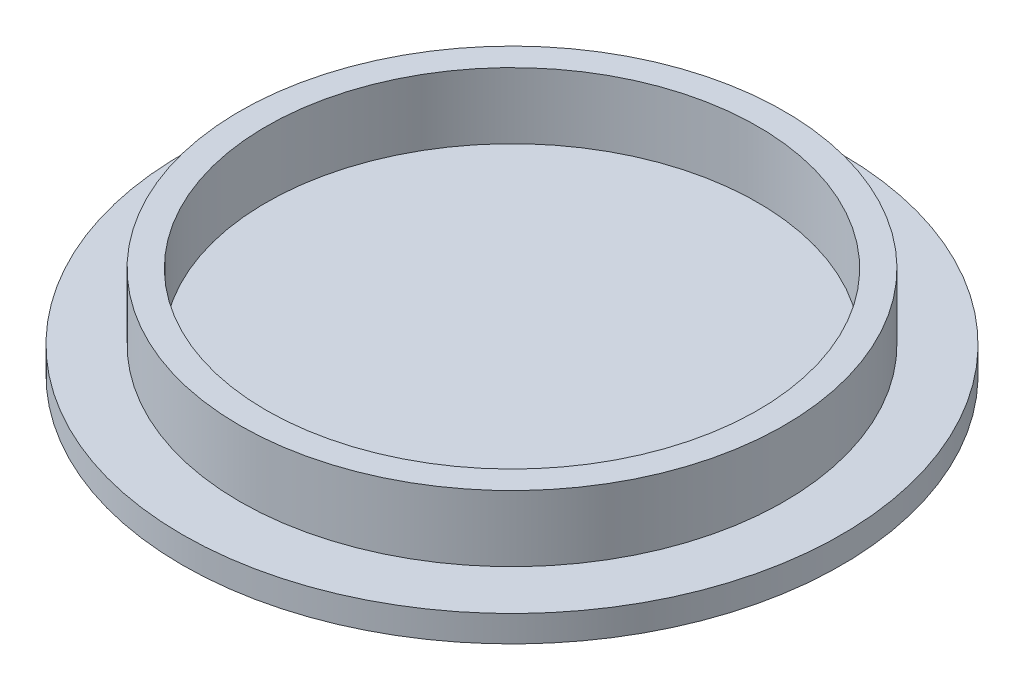
ISO-10303-21;
HEADER;
FILE_DESCRIPTION(('STEP AP214'),'2;1');
FILE_NAME('part.step','',(''),(''),'','','');
FILE_SCHEMA(('AUTOMOTIVE_DESIGN { 1 0 10303 214 1 1 1 1 }'));
ENDSEC;
DATA;
#1=APPLICATION_CONTEXT('core data for automotive mechanical design processes');
#2=APPLICATION_PROTOCOL_DEFINITION('international standard','automotive_design',2000,#1);
#3=PRODUCT_CONTEXT('',#1,'mechanical');
#4=PRODUCT('Part','Part','',(#3));
#5=PRODUCT_RELATED_PRODUCT_CATEGORY('part','',(#4));
#6=PRODUCT_DEFINITION_FORMATION('','',#4);
#7=PRODUCT_DEFINITION_CONTEXT('part definition',#1,'design');
#8=PRODUCT_DEFINITION('design','',#6,#7);
#9=PRODUCT_DEFINITION_SHAPE('','',#8);
#10=(LENGTH_UNIT() NAMED_UNIT(*) SI_UNIT(.MILLI.,.METRE.));
#11=(NAMED_UNIT(*) PLANE_ANGLE_UNIT() SI_UNIT($,.RADIAN.));
#12=(NAMED_UNIT(*) SI_UNIT($,.STERADIAN.) SOLID_ANGLE_UNIT());
#13=UNCERTAINTY_MEASURE_WITH_UNIT(LENGTH_MEASURE(1.E-05),#10,'distance_accuracy_value','');
#14=(GEOMETRIC_REPRESENTATION_CONTEXT(3) GLOBAL_UNCERTAINTY_ASSIGNED_CONTEXT((#13)) GLOBAL_UNIT_ASSIGNED_CONTEXT((#10,
#11,#12)) REPRESENTATION_CONTEXT('',''));
#15=CARTESIAN_POINT('',(0.,0.,0.));
#16=DIRECTION('',(0.,0.,1.));
#17=DIRECTION('',(1.,0.,0.));
#18=AXIS2_PLACEMENT_3D('',#15,#16,#17);
#19=CARTESIAN_POINT('',(0.,5.08,0.));
#20=DIRECTION('',(0.,-1.,0.));
#21=DIRECTION('',(0.,0.,-1.));
#22=AXIS2_PLACEMENT_3D('',#19,#20,#21);
#23=CYLINDRICAL_SURFACE('',#22,63.5);
#24=CARTESIAN_POINT('',(0.,5.08,0.));
#25=DIRECTION('',(0.,1.,0.));
#26=DIRECTION('',(0.,0.,1.));
#27=AXIS2_PLACEMENT_3D('',#24,#25,#26);
#28=CIRCLE('',#27,63.5);
#29=CARTESIAN_POINT('',(0.,5.08,63.5));
#30=VERTEX_POINT('',#29);
#31=EDGE_CURVE('E48',#30,#30,#28,.T.);
#32=ORIENTED_EDGE('',*,*,#31,.F.);
#33=EDGE_LOOP('',(#32));
#34=FACE_BOUND('',#33,.T.);
#35=CARTESIAN_POINT('',(0.,0.,0.));
#36=DIRECTION('',(0.,1.,0.));
#37=DIRECTION('',(0.,0.,1.));
#38=AXIS2_PLACEMENT_3D('',#35,#36,#37);
#39=CIRCLE('',#38,63.5);
#40=CARTESIAN_POINT('',(0.,0.,63.5));
#41=VERTEX_POINT('',#40);
#42=EDGE_CURVE('E53',#41,#41,#39,.T.);
#43=ORIENTED_EDGE('',*,*,#42,.T.);
#44=EDGE_LOOP('',(#43));
#45=FACE_BOUND('',#44,.T.);
#46=ADVANCED_FACE('F41',(#34,#45),#23,.T.);
#47=CARTESIAN_POINT('',(0.,5.08,0.));
#48=DIRECTION('',(0.,1.,0.));
#49=DIRECTION('',(0.,0.,1.));
#50=AXIS2_PLACEMENT_3D('',#47,#48,#49);
#51=PLANE('',#50);
#52=CARTESIAN_POINT('',(0.,5.08,0.));
#53=DIRECTION('',(0.,1.,0.));
#54=DIRECTION('',(0.,0.,1.));
#55=AXIS2_PLACEMENT_3D('',#52,#53,#54);
#56=CIRCLE('',#55,52.451);
#57=CARTESIAN_POINT('',(0.,5.08,52.451));
#58=VERTEX_POINT('',#57);
#59=EDGE_CURVE('E61',#58,#58,#56,.T.);
#60=ORIENTED_EDGE('',*,*,#59,.F.);
#61=EDGE_LOOP('',(#60));
#62=FACE_BOUND('',#61,.T.);
#63=ORIENTED_EDGE('',*,*,#31,.T.);
#64=EDGE_LOOP('',(#63));
#65=FACE_BOUND('',#64,.T.);
#66=ADVANCED_FACE('F87',(#62,#65),#51,.T.);
#67=CARTESIAN_POINT('',(0.,0.,0.));
#68=DIRECTION('',(0.,1.,0.));
#69=DIRECTION('',(0.,0.,1.));
#70=AXIS2_PLACEMENT_3D('',#67,#68,#69);
#71=PLANE('',#70);
#72=ORIENTED_EDGE('',*,*,#42,.F.);
#73=EDGE_LOOP('',(#72));
#74=FACE_BOUND('',#73,.T.);
#75=ADVANCED_FACE('F78',(#74),#71,.F.);
#76=CARTESIAN_POINT('',(0.,17.78,0.));
#77=DIRECTION('',(0.,1.,0.));
#78=DIRECTION('',(0.,0.,1.));
#79=AXIS2_PLACEMENT_3D('',#76,#77,#78);
#80=PLANE('',#79);
#81=CARTESIAN_POINT('',(0.,17.78,0.));
#82=DIRECTION('',(0.,1.,0.));
#83=DIRECTION('',(0.,0.,1.));
#84=AXIS2_PLACEMENT_3D('',#81,#82,#83);
#85=CIRCLE('',#84,52.451);
#86=CARTESIAN_POINT('',(0.,17.78,52.451));
#87=VERTEX_POINT('',#86);
#88=EDGE_CURVE('E59',#87,#87,#85,.T.);
#89=ORIENTED_EDGE('',*,*,#88,.T.);
#90=EDGE_LOOP('',(#89));
#91=FACE_BOUND('',#90,.T.);
#92=CARTESIAN_POINT('',(0.,17.78,0.));
#93=DIRECTION('',(0.,1.,0.));
#94=DIRECTION('',(0.,0.,1.));
#95=AXIS2_PLACEMENT_3D('',#92,#93,#94);
#96=CIRCLE('',#95,47.371);
#97=CARTESIAN_POINT('',(0.,17.78,47.371));
#98=VERTEX_POINT('',#97);
#99=EDGE_CURVE('E65',#98,#98,#96,.T.);
#100=ORIENTED_EDGE('',*,*,#99,.F.);
#101=EDGE_LOOP('',(#100));
#102=FACE_BOUND('',#101,.T.);
#103=ADVANCED_FACE('F75',(#91,#102),#80,.T.);
#104=CARTESIAN_POINT('',(0.,17.78,0.));
#105=DIRECTION('',(0.,-1.,0.));
#106=DIRECTION('',(0.,0.,-1.));
#107=AXIS2_PLACEMENT_3D('',#104,#105,#106);
#108=CYLINDRICAL_SURFACE('',#107,52.451);
#109=ORIENTED_EDGE('',*,*,#88,.F.);
#110=EDGE_LOOP('',(#109));
#111=FACE_BOUND('',#110,.T.);
#112=ORIENTED_EDGE('',*,*,#59,.T.);
#113=EDGE_LOOP('',(#112));
#114=FACE_BOUND('',#113,.T.);
#115=ADVANCED_FACE('F77',(#111,#114),#108,.T.);
#116=CARTESIAN_POINT('',(0.,17.78,0.));
#117=DIRECTION('',(0.,-1.,0.));
#118=DIRECTION('',(0.,0.,-1.));
#119=AXIS2_PLACEMENT_3D('',#116,#117,#118);
#120=CYLINDRICAL_SURFACE('',#119,47.371);
#121=ORIENTED_EDGE('',*,*,#99,.T.);
#122=EDGE_LOOP('',(#121));
#123=FACE_BOUND('',#122,.T.);
#124=CARTESIAN_POINT('',(0.,5.08,0.));
#125=DIRECTION('',(0.,1.,0.));
#126=DIRECTION('',(0.,0.,1.));
#127=AXIS2_PLACEMENT_3D('',#124,#125,#126);
#128=CIRCLE('',#127,47.371);
#129=CARTESIAN_POINT('',(0.,5.08,47.371));
#130=VERTEX_POINT('',#129);
#131=EDGE_CURVE('E10',#130,#130,#128,.F.);
#132=ORIENTED_EDGE('',*,*,#131,.T.);
#133=EDGE_LOOP('',(#132));
#134=FACE_BOUND('',#133,.T.);
#135=ADVANCED_FACE('F73',(#123,#134),#120,.F.);
#136=ORIENTED_EDGE('',*,*,#131,.F.);
#137=EDGE_LOOP('',(#136));
#138=FACE_BOUND('',#137,.T.);
#139=ADVANCED_FACE('F97',(#138),#51,.T.);
#140=CLOSED_SHELL('',(#46,#66,#75,#103,#115,#135,#139));
#141=MANIFOLD_SOLID_BREP('B2',#140);
#142=ADVANCED_BREP_SHAPE_REPRESENTATION('',(#18,#141),#14);
#143=SHAPE_DEFINITION_REPRESENTATION(#9,#142);
ENDSEC;
END-ISO-10303-21;
